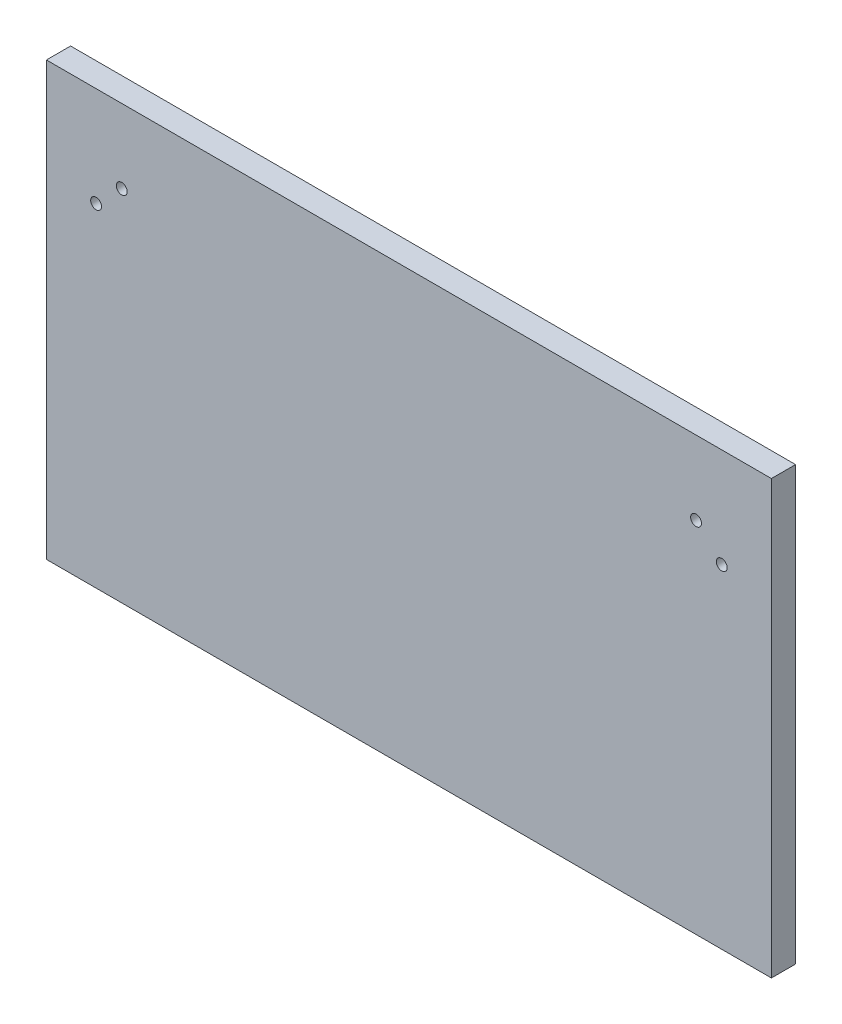
ISO-10303-21;
HEADER;
FILE_DESCRIPTION(('STEP AP214'),'2;1');
FILE_NAME('part.step','',(''),(''),'','','');
FILE_SCHEMA(('AUTOMOTIVE_DESIGN { 1 0 10303 214 1 1 1 1 }'));
ENDSEC;
DATA;
#1=APPLICATION_CONTEXT('core data for automotive mechanical design processes');
#2=APPLICATION_PROTOCOL_DEFINITION('international standard','automotive_design',2000,#1);
#3=PRODUCT_CONTEXT('',#1,'mechanical');
#4=PRODUCT('Part','Part','',(#3));
#5=PRODUCT_RELATED_PRODUCT_CATEGORY('part','',(#4));
#6=PRODUCT_DEFINITION_FORMATION('','',#4);
#7=PRODUCT_DEFINITION_CONTEXT('part definition',#1,'design');
#8=PRODUCT_DEFINITION('design','',#6,#7);
#9=PRODUCT_DEFINITION_SHAPE('','',#8);
#10=(LENGTH_UNIT() NAMED_UNIT(*) SI_UNIT(.MILLI.,.METRE.));
#11=(NAMED_UNIT(*) PLANE_ANGLE_UNIT() SI_UNIT($,.RADIAN.));
#12=(NAMED_UNIT(*) SI_UNIT($,.STERADIAN.) SOLID_ANGLE_UNIT());
#13=UNCERTAINTY_MEASURE_WITH_UNIT(LENGTH_MEASURE(1.E-05),#10,'distance_accuracy_value','');
#14=(GEOMETRIC_REPRESENTATION_CONTEXT(3) GLOBAL_UNCERTAINTY_ASSIGNED_CONTEXT((#13)) GLOBAL_UNIT_ASSIGNED_CONTEXT((#10,
#11,#12)) REPRESENTATION_CONTEXT('',''));
#15=CARTESIAN_POINT('',(0.,0.,0.));
#16=DIRECTION('',(0.,0.,1.));
#17=DIRECTION('',(1.,0.,0.));
#18=AXIS2_PLACEMENT_3D('',#15,#16,#17);
#19=CARTESIAN_POINT('',(0.,0.,10.));
#20=DIRECTION('',(-1.,0.,0.));
#21=DIRECTION('',(0.,0.,1.));
#22=AXIS2_PLACEMENT_3D('',#19,#20,#21);
#23=PLANE('',#22);
#24=DIRECTION('',(0.,1.,0.));
#25=VECTOR('',#24,1.);
#26=CARTESIAN_POINT('',(0.,0.,0.));
#27=LINE('',#26,#25);
#28=CARTESIAN_POINT('',(0.,0.,0.));
#29=VERTEX_POINT('',#28);
#30=CARTESIAN_POINT('',(0.,179.,0.));
#31=VERTEX_POINT('',#30);
#32=EDGE_CURVE('E100',#29,#31,#27,.T.);
#33=ORIENTED_EDGE('',*,*,#32,.T.);
#34=DIRECTION('',(0.,0.,-1.));
#35=VECTOR('',#34,1.);
#36=CARTESIAN_POINT('',(0.,179.,10.));
#37=LINE('',#36,#35);
#38=CARTESIAN_POINT('',(0.,179.,10.));
#39=VERTEX_POINT('',#38);
#40=EDGE_CURVE('E11',#39,#31,#37,.T.);
#41=ORIENTED_EDGE('',*,*,#40,.F.);
#42=DIRECTION('',(0.,1.,0.));
#43=VECTOR('',#42,1.);
#44=CARTESIAN_POINT('',(0.,0.,10.));
#45=LINE('',#44,#43);
#46=CARTESIAN_POINT('',(0.,0.,10.));
#47=VERTEX_POINT('',#46);
#48=EDGE_CURVE('E88',#47,#39,#45,.T.);
#49=ORIENTED_EDGE('',*,*,#48,.F.);
#50=DIRECTION('',(0.,0.,-1.));
#51=VECTOR('',#50,1.);
#52=CARTESIAN_POINT('',(0.,0.,10.));
#53=LINE('',#52,#51);
#54=EDGE_CURVE('E96',#47,#29,#53,.T.);
#55=ORIENTED_EDGE('',*,*,#54,.T.);
#56=EDGE_LOOP('',(#33,#41,#49,#55));
#57=FACE_BOUND('',#56,.T.);
#58=ADVANCED_FACE('F37',(#57),#23,.F.);
#59=CARTESIAN_POINT('',(0.,179.,10.));
#60=DIRECTION('',(0.,-1.,0.));
#61=DIRECTION('',(1.,0.,0.));
#62=AXIS2_PLACEMENT_3D('',#59,#60,#61);
#63=PLANE('',#62);
#64=DIRECTION('',(-1.,0.,0.));
#65=VECTOR('',#64,1.);
#66=CARTESIAN_POINT('',(0.,179.,0.));
#67=LINE('',#66,#65);
#68=CARTESIAN_POINT('',(-300.,179.,0.));
#69=VERTEX_POINT('',#68);
#70=EDGE_CURVE('E92',#31,#69,#67,.T.);
#71=ORIENTED_EDGE('',*,*,#70,.T.);
#72=DIRECTION('',(0.,0.,-1.));
#73=VECTOR('',#72,1.);
#74=CARTESIAN_POINT('',(-300.,179.,10.));
#75=LINE('',#74,#73);
#76=CARTESIAN_POINT('',(-300.,179.,10.));
#77=VERTEX_POINT('',#76);
#78=EDGE_CURVE('E45',#77,#69,#75,.T.);
#79=ORIENTED_EDGE('',*,*,#78,.F.);
#80=DIRECTION('',(-1.,0.,0.));
#81=VECTOR('',#80,1.);
#82=CARTESIAN_POINT('',(0.,179.,10.));
#83=LINE('',#82,#81);
#84=EDGE_CURVE('E83',#39,#77,#83,.T.);
#85=ORIENTED_EDGE('',*,*,#84,.F.);
#86=ORIENTED_EDGE('',*,*,#40,.T.);
#87=EDGE_LOOP('',(#71,#79,#85,#86));
#88=FACE_BOUND('',#87,.T.);
#89=ADVANCED_FACE('F91',(#88),#63,.F.);
#90=CARTESIAN_POINT('',(-300.,0.,10.));
#91=DIRECTION('',(1.,0.,0.));
#92=DIRECTION('',(0.,0.,-1.));
#93=AXIS2_PLACEMENT_3D('',#90,#91,#92);
#94=PLANE('',#93);
#95=DIRECTION('',(0.,-1.,0.));
#96=VECTOR('',#95,1.);
#97=CARTESIAN_POINT('',(-300.,0.,0.));
#98=LINE('',#97,#96);
#99=CARTESIAN_POINT('',(-300.,0.,0.));
#100=VERTEX_POINT('',#99);
#101=EDGE_CURVE('E70',#69,#100,#98,.T.);
#102=ORIENTED_EDGE('',*,*,#101,.T.);
#103=DIRECTION('',(0.,0.,-1.));
#104=VECTOR('',#103,1.);
#105=CARTESIAN_POINT('',(-300.,0.,10.));
#106=LINE('',#105,#104);
#107=CARTESIAN_POINT('',(-300.,0.,10.));
#108=VERTEX_POINT('',#107);
#109=EDGE_CURVE('E93',#108,#100,#106,.T.);
#110=ORIENTED_EDGE('',*,*,#109,.F.);
#111=DIRECTION('',(0.,-1.,0.));
#112=VECTOR('',#111,1.);
#113=CARTESIAN_POINT('',(-300.,0.,10.));
#114=LINE('',#113,#112);
#115=EDGE_CURVE('E86',#77,#108,#114,.T.);
#116=ORIENTED_EDGE('',*,*,#115,.F.);
#117=ORIENTED_EDGE('',*,*,#78,.T.);
#118=EDGE_LOOP('',(#102,#110,#116,#117));
#119=FACE_BOUND('',#118,.T.);
#120=ADVANCED_FACE('F94',(#119),#94,.F.);
#121=CARTESIAN_POINT('',(0.,0.,10.));
#122=DIRECTION('',(0.,1.,0.));
#123=DIRECTION('',(-1.,0.,0.));
#124=AXIS2_PLACEMENT_3D('',#121,#122,#123);
#125=PLANE('',#124);
#126=DIRECTION('',(1.,0.,0.));
#127=VECTOR('',#126,1.);
#128=CARTESIAN_POINT('',(0.,0.,0.));
#129=LINE('',#128,#127);
#130=EDGE_CURVE('E76',#100,#29,#129,.T.);
#131=ORIENTED_EDGE('',*,*,#130,.T.);
#132=ORIENTED_EDGE('',*,*,#54,.F.);
#133=DIRECTION('',(1.,0.,0.));
#134=VECTOR('',#133,1.);
#135=CARTESIAN_POINT('',(0.,0.,10.));
#136=LINE('',#135,#134);
#137=EDGE_CURVE('E53',#108,#47,#136,.T.);
#138=ORIENTED_EDGE('',*,*,#137,.F.);
#139=ORIENTED_EDGE('',*,*,#109,.T.);
#140=EDGE_LOOP('',(#131,#132,#138,#139));
#141=FACE_BOUND('',#140,.T.);
#142=ADVANCED_FACE('F108',(#141),#125,.F.);
#143=CARTESIAN_POINT('',(0.,0.,10.));
#144=DIRECTION('',(0.,0.,1.));
#145=DIRECTION('',(1.,0.,0.));
#146=AXIS2_PLACEMENT_3D('',#143,#144,#145);
#147=PLANE('',#146);
#148=CARTESIAN_POINT('',(-279.44543648263,137.838834764832,10.));
#149=DIRECTION('',(0.,0.,1.));
#150=DIRECTION('',(1.,0.,0.));
#151=AXIS2_PLACEMENT_3D('',#148,#149,#150);
#152=CIRCLE('',#151,2.24999999999996);
#153=CARTESIAN_POINT('',(-277.19543648263,137.838834764832,10.));
#154=VERTEX_POINT('',#153);
#155=EDGE_CURVE('E123',#154,#154,#152,.T.);
#156=ORIENTED_EDGE('',*,*,#155,.F.);
#157=EDGE_LOOP('',(#156));
#158=FACE_BOUND('',#157,.T.);
#159=CARTESIAN_POINT('',(-268.838834764832,148.44543648263,10.));
#160=DIRECTION('',(0.,0.,1.));
#161=DIRECTION('',(1.,0.,0.));
#162=AXIS2_PLACEMENT_3D('',#159,#160,#161);
#163=CIRCLE('',#162,2.24999999999996);
#164=CARTESIAN_POINT('',(-266.588834764832,148.44543648263,10.));
#165=VERTEX_POINT('',#164);
#166=EDGE_CURVE('E129',#165,#165,#163,.T.);
#167=ORIENTED_EDGE('',*,*,#166,.F.);
#168=EDGE_LOOP('',(#167));
#169=FACE_BOUND('',#168,.T.);
#170=CARTESIAN_POINT('',(-20.5545635173698,137.838834764832,10.));
#171=DIRECTION('',(0.,0.,1.));
#172=DIRECTION('',(1.,0.,0.));
#173=AXIS2_PLACEMENT_3D('',#170,#171,#172);
#174=CIRCLE('',#173,2.25);
#175=CARTESIAN_POINT('',(-18.3045635173698,137.838834764832,10.));
#176=VERTEX_POINT('',#175);
#177=EDGE_CURVE('E117',#176,#176,#174,.T.);
#178=ORIENTED_EDGE('',*,*,#177,.F.);
#179=EDGE_LOOP('',(#178));
#180=FACE_BOUND('',#179,.T.);
#181=CARTESIAN_POINT('',(-31.161165235168,148.44543648263,10.));
#182=DIRECTION('',(0.,0.,1.));
#183=DIRECTION('',(1.,0.,0.));
#184=AXIS2_PLACEMENT_3D('',#181,#182,#183);
#185=CIRCLE('',#184,2.25);
#186=CARTESIAN_POINT('',(-28.911165235168,148.44543648263,10.));
#187=VERTEX_POINT('',#186);
#188=EDGE_CURVE('E114',#187,#187,#185,.T.);
#189=ORIENTED_EDGE('',*,*,#188,.F.);
#190=EDGE_LOOP('',(#189));
#191=FACE_BOUND('',#190,.T.);
#192=ORIENTED_EDGE('',*,*,#48,.T.);
#193=ORIENTED_EDGE('',*,*,#84,.T.);
#194=ORIENTED_EDGE('',*,*,#115,.T.);
#195=ORIENTED_EDGE('',*,*,#137,.T.);
#196=EDGE_LOOP('',(#192,#193,#194,#195));
#197=FACE_BOUND('',#196,.T.);
#198=ADVANCED_FACE('F84',(#158,#169,#180,#191,#197),#147,.T.);
#199=CARTESIAN_POINT('',(0.,0.,0.));
#200=DIRECTION('',(0.,0.,1.));
#201=DIRECTION('',(1.,0.,0.));
#202=AXIS2_PLACEMENT_3D('',#199,#200,#201);
#203=PLANE('',#202);
#204=CARTESIAN_POINT('',(-279.44543648263,137.838834764832,0.));
#205=DIRECTION('',(0.,0.,1.));
#206=DIRECTION('',(1.,0.,0.));
#207=AXIS2_PLACEMENT_3D('',#204,#205,#206);
#208=CIRCLE('',#207,2.24999999999996);
#209=CARTESIAN_POINT('',(-277.19543648263,137.838834764832,0.));
#210=VERTEX_POINT('',#209);
#211=EDGE_CURVE('E120',#210,#210,#208,.T.);
#212=ORIENTED_EDGE('',*,*,#211,.T.);
#213=EDGE_LOOP('',(#212));
#214=FACE_BOUND('',#213,.T.);
#215=CARTESIAN_POINT('',(-268.838834764832,148.44543648263,0.));
#216=DIRECTION('',(0.,0.,1.));
#217=DIRECTION('',(1.,0.,0.));
#218=AXIS2_PLACEMENT_3D('',#215,#216,#217);
#219=CIRCLE('',#218,2.24999999999996);
#220=CARTESIAN_POINT('',(-266.588834764832,148.44543648263,0.));
#221=VERTEX_POINT('',#220);
#222=EDGE_CURVE('E126',#221,#221,#219,.T.);
#223=ORIENTED_EDGE('',*,*,#222,.T.);
#224=EDGE_LOOP('',(#223));
#225=FACE_BOUND('',#224,.T.);
#226=CARTESIAN_POINT('',(-20.5545635173698,137.838834764832,0.));
#227=DIRECTION('',(0.,0.,1.));
#228=DIRECTION('',(1.,0.,0.));
#229=AXIS2_PLACEMENT_3D('',#226,#227,#228);
#230=CIRCLE('',#229,2.25);
#231=CARTESIAN_POINT('',(-18.3045635173698,137.838834764832,0.));
#232=VERTEX_POINT('',#231);
#233=EDGE_CURVE('E132',#232,#232,#230,.T.);
#234=ORIENTED_EDGE('',*,*,#233,.T.);
#235=EDGE_LOOP('',(#234));
#236=FACE_BOUND('',#235,.T.);
#237=CARTESIAN_POINT('',(-31.161165235168,148.44543648263,0.));
#238=DIRECTION('',(0.,0.,1.));
#239=DIRECTION('',(1.,0.,0.));
#240=AXIS2_PLACEMENT_3D('',#237,#238,#239);
#241=CIRCLE('',#240,2.25);
#242=CARTESIAN_POINT('',(-28.911165235168,148.44543648263,0.));
#243=VERTEX_POINT('',#242);
#244=EDGE_CURVE('E103',#243,#243,#241,.T.);
#245=ORIENTED_EDGE('',*,*,#244,.T.);
#246=EDGE_LOOP('',(#245));
#247=FACE_BOUND('',#246,.T.);
#248=ORIENTED_EDGE('',*,*,#32,.F.);
#249=ORIENTED_EDGE('',*,*,#130,.F.);
#250=ORIENTED_EDGE('',*,*,#101,.F.);
#251=ORIENTED_EDGE('',*,*,#70,.F.);
#252=EDGE_LOOP('',(#248,#249,#250,#251));
#253=FACE_BOUND('',#252,.T.);
#254=ADVANCED_FACE('F111',(#214,#225,#236,#247,#253),#203,.F.);
#255=CARTESIAN_POINT('',(-31.161165235168,148.44543648263,0.));
#256=DIRECTION('',(0.,0.,1.));
#257=DIRECTION('',(1.,0.,0.));
#258=AXIS2_PLACEMENT_3D('',#255,#256,#257);
#259=CYLINDRICAL_SURFACE('',#258,2.25);
#260=ORIENTED_EDGE('',*,*,#244,.F.);
#261=EDGE_LOOP('',(#260));
#262=FACE_BOUND('',#261,.T.);
#263=ORIENTED_EDGE('',*,*,#188,.T.);
#264=EDGE_LOOP('',(#263));
#265=FACE_BOUND('',#264,.T.);
#266=ADVANCED_FACE('F146',(#262,#265),#259,.F.);
#267=CARTESIAN_POINT('',(-20.5545635173698,137.838834764832,0.));
#268=DIRECTION('',(0.,0.,1.));
#269=DIRECTION('',(1.,0.,0.));
#270=AXIS2_PLACEMENT_3D('',#267,#268,#269);
#271=CYLINDRICAL_SURFACE('',#270,2.25);
#272=ORIENTED_EDGE('',*,*,#233,.F.);
#273=EDGE_LOOP('',(#272));
#274=FACE_BOUND('',#273,.T.);
#275=ORIENTED_EDGE('',*,*,#177,.T.);
#276=EDGE_LOOP('',(#275));
#277=FACE_BOUND('',#276,.T.);
#278=ADVANCED_FACE('F138',(#274,#277),#271,.F.);
#279=CARTESIAN_POINT('',(-268.838834764832,148.44543648263,0.));
#280=DIRECTION('',(0.,0.,1.));
#281=DIRECTION('',(1.,0.,0.));
#282=AXIS2_PLACEMENT_3D('',#279,#280,#281);
#283=CYLINDRICAL_SURFACE('',#282,2.24999999999996);
#284=ORIENTED_EDGE('',*,*,#222,.F.);
#285=EDGE_LOOP('',(#284));
#286=FACE_BOUND('',#285,.T.);
#287=ORIENTED_EDGE('',*,*,#166,.T.);
#288=EDGE_LOOP('',(#287));
#289=FACE_BOUND('',#288,.T.);
#290=ADVANCED_FACE('F154',(#286,#289),#283,.F.);
#291=CARTESIAN_POINT('',(-279.44543648263,137.838834764832,0.));
#292=DIRECTION('',(0.,0.,1.));
#293=DIRECTION('',(1.,0.,0.));
#294=AXIS2_PLACEMENT_3D('',#291,#292,#293);
#295=CYLINDRICAL_SURFACE('',#294,2.24999999999996);
#296=ORIENTED_EDGE('',*,*,#211,.F.);
#297=EDGE_LOOP('',(#296));
#298=FACE_BOUND('',#297,.T.);
#299=ORIENTED_EDGE('',*,*,#155,.T.);
#300=EDGE_LOOP('',(#299));
#301=FACE_BOUND('',#300,.T.);
#302=ADVANCED_FACE('F205',(#298,#301),#295,.F.);
#303=CLOSED_SHELL('',(#58,#89,#120,#142,#198,#254,#266,#278,#290,#302));
#304=MANIFOLD_SOLID_BREP('B2',#303);
#305=ADVANCED_BREP_SHAPE_REPRESENTATION('',(#18,#304),#14);
#306=SHAPE_DEFINITION_REPRESENTATION(#9,#305);
ENDSEC;
END-ISO-10303-21;
